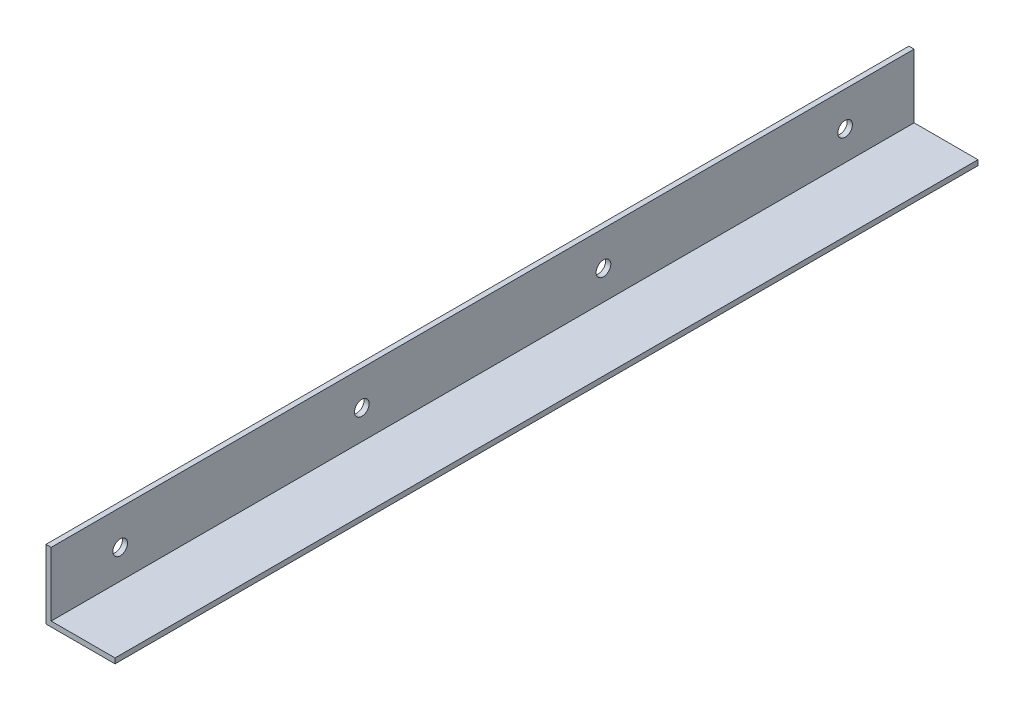
ISO-10303-21;
HEADER;
FILE_DESCRIPTION(('STEP AP214'),'2;1');
FILE_NAME('part.step','',(''),(''),'','','');
FILE_SCHEMA(('AUTOMOTIVE_DESIGN { 1 0 10303 214 1 1 1 1 }'));
ENDSEC;
DATA;
#1=APPLICATION_CONTEXT('core data for automotive mechanical design processes');
#2=APPLICATION_PROTOCOL_DEFINITION('international standard','automotive_design',2000,#1);
#3=PRODUCT_CONTEXT('',#1,'mechanical');
#4=PRODUCT('Part','Part','',(#3));
#5=PRODUCT_RELATED_PRODUCT_CATEGORY('part','',(#4));
#6=PRODUCT_DEFINITION_FORMATION('','',#4);
#7=PRODUCT_DEFINITION_CONTEXT('part definition',#1,'design');
#8=PRODUCT_DEFINITION('design','',#6,#7);
#9=PRODUCT_DEFINITION_SHAPE('','',#8);
#10=(LENGTH_UNIT() NAMED_UNIT(*) SI_UNIT(.MILLI.,.METRE.));
#11=(NAMED_UNIT(*) PLANE_ANGLE_UNIT() SI_UNIT($,.RADIAN.));
#12=(NAMED_UNIT(*) SI_UNIT($,.STERADIAN.) SOLID_ANGLE_UNIT());
#13=UNCERTAINTY_MEASURE_WITH_UNIT(LENGTH_MEASURE(1.E-05),#10,'distance_accuracy_value','');
#14=(GEOMETRIC_REPRESENTATION_CONTEXT(3) GLOBAL_UNCERTAINTY_ASSIGNED_CONTEXT((#13)) GLOBAL_UNIT_ASSIGNED_CONTEXT((#10,
#11,#12)) REPRESENTATION_CONTEXT('',''));
#15=CARTESIAN_POINT('',(0.,0.,0.));
#16=DIRECTION('',(0.,0.,1.));
#17=DIRECTION('',(1.,0.,0.));
#18=AXIS2_PLACEMENT_3D('',#15,#16,#17);
#19=CARTESIAN_POINT('',(0.,0.,500.));
#20=DIRECTION('',(0.,1.,0.));
#21=DIRECTION('',(0.,0.,1.));
#22=AXIS2_PLACEMENT_3D('',#19,#20,#21);
#23=PLANE('',#22);
#24=DIRECTION('',(1.,0.,0.));
#25=VECTOR('',#24,1.);
#26=CARTESIAN_POINT('',(0.,0.,0.));
#27=LINE('',#26,#25);
#28=CARTESIAN_POINT('',(0.,0.,0.));
#29=VERTEX_POINT('',#28);
#30=CARTESIAN_POINT('',(40.,0.,0.));
#31=VERTEX_POINT('',#30);
#32=EDGE_CURVE('E118',#29,#31,#27,.T.);
#33=ORIENTED_EDGE('',*,*,#32,.T.);
#34=DIRECTION('',(0.,0.,-1.));
#35=VECTOR('',#34,1.);
#36=CARTESIAN_POINT('',(40.,0.,500.));
#37=LINE('',#36,#35);
#38=CARTESIAN_POINT('',(40.,0.,500.));
#39=VERTEX_POINT('',#38);
#40=EDGE_CURVE('E11',#39,#31,#37,.T.);
#41=ORIENTED_EDGE('',*,*,#40,.F.);
#42=DIRECTION('',(1.,0.,0.));
#43=VECTOR('',#42,1.);
#44=CARTESIAN_POINT('',(0.,0.,500.));
#45=LINE('',#44,#43);
#46=CARTESIAN_POINT('',(0.,0.,500.));
#47=VERTEX_POINT('',#46);
#48=EDGE_CURVE('E129',#47,#39,#45,.T.);
#49=ORIENTED_EDGE('',*,*,#48,.F.);
#50=DIRECTION('',(0.,0.,-1.));
#51=VECTOR('',#50,1.);
#52=CARTESIAN_POINT('',(0.,0.,500.));
#53=LINE('',#52,#51);
#54=EDGE_CURVE('E114',#47,#29,#53,.T.);
#55=ORIENTED_EDGE('',*,*,#54,.T.);
#56=EDGE_LOOP('',(#33,#41,#49,#55));
#57=FACE_BOUND('',#56,.T.);
#58=ADVANCED_FACE('F34',(#57),#23,.F.);
#59=CARTESIAN_POINT('',(40.,3.,500.));
#60=DIRECTION('',(-1.,0.,0.));
#61=DIRECTION('',(0.,0.,1.));
#62=AXIS2_PLACEMENT_3D('',#59,#60,#61);
#63=PLANE('',#62);
#64=DIRECTION('',(0.,1.,0.));
#65=VECTOR('',#64,1.);
#66=CARTESIAN_POINT('',(40.,3.,0.));
#67=LINE('',#66,#65);
#68=CARTESIAN_POINT('',(40.,3.,0.));
#69=VERTEX_POINT('',#68);
#70=EDGE_CURVE('E121',#31,#69,#67,.T.);
#71=ORIENTED_EDGE('',*,*,#70,.T.);
#72=DIRECTION('',(0.,0.,-1.));
#73=VECTOR('',#72,1.);
#74=CARTESIAN_POINT('',(40.,3.,500.));
#75=LINE('',#74,#73);
#76=CARTESIAN_POINT('',(40.,3.,500.));
#77=VERTEX_POINT('',#76);
#78=EDGE_CURVE('E42',#77,#69,#75,.T.);
#79=ORIENTED_EDGE('',*,*,#78,.F.);
#80=DIRECTION('',(0.,1.,0.));
#81=VECTOR('',#80,1.);
#82=CARTESIAN_POINT('',(40.,3.,500.));
#83=LINE('',#82,#81);
#84=EDGE_CURVE('E87',#39,#77,#83,.T.);
#85=ORIENTED_EDGE('',*,*,#84,.F.);
#86=ORIENTED_EDGE('',*,*,#40,.T.);
#87=EDGE_LOOP('',(#71,#79,#85,#86));
#88=FACE_BOUND('',#87,.T.);
#89=ADVANCED_FACE('F156',(#88),#63,.F.);
#90=CARTESIAN_POINT('',(3.,3.,500.));
#91=DIRECTION('',(0.,-1.,0.));
#92=DIRECTION('',(0.,0.,-1.));
#93=AXIS2_PLACEMENT_3D('',#90,#91,#92);
#94=PLANE('',#93);
#95=DIRECTION('',(-1.,0.,0.));
#96=VECTOR('',#95,1.);
#97=CARTESIAN_POINT('',(3.,3.,0.));
#98=LINE('',#97,#96);
#99=CARTESIAN_POINT('',(3.,3.,0.));
#100=VERTEX_POINT('',#99);
#101=EDGE_CURVE('E124',#69,#100,#98,.T.);
#102=ORIENTED_EDGE('',*,*,#101,.T.);
#103=DIRECTION('',(0.,0.,-1.));
#104=VECTOR('',#103,1.);
#105=CARTESIAN_POINT('',(3.,3.,500.));
#106=LINE('',#105,#104);
#107=CARTESIAN_POINT('',(3.,3.,500.));
#108=VERTEX_POINT('',#107);
#109=EDGE_CURVE('E109',#108,#100,#106,.T.);
#110=ORIENTED_EDGE('',*,*,#109,.F.);
#111=DIRECTION('',(-1.,0.,0.));
#112=VECTOR('',#111,1.);
#113=CARTESIAN_POINT('',(3.,3.,500.));
#114=LINE('',#113,#112);
#115=EDGE_CURVE('E100',#77,#108,#114,.T.);
#116=ORIENTED_EDGE('',*,*,#115,.F.);
#117=ORIENTED_EDGE('',*,*,#78,.T.);
#118=EDGE_LOOP('',(#102,#110,#116,#117));
#119=FACE_BOUND('',#118,.T.);
#120=ADVANCED_FACE('F135',(#119),#94,.F.);
#121=CARTESIAN_POINT('',(3.,3.,500.));
#122=DIRECTION('',(-1.,0.,0.));
#123=DIRECTION('',(0.,0.,1.));
#124=AXIS2_PLACEMENT_3D('',#121,#122,#123);
#125=PLANE('',#124);
#126=CARTESIAN_POINT('',(3.,20.,40.));
#127=DIRECTION('',(-1.,0.,0.));
#128=DIRECTION('',(0.,0.,1.));
#129=AXIS2_PLACEMENT_3D('',#126,#127,#128);
#130=CIRCLE('',#129,4.25);
#131=CARTESIAN_POINT('',(3.,20.,44.25));
#132=VERTEX_POINT('',#131);
#133=EDGE_CURVE('E122',#132,#132,#130,.T.);
#134=ORIENTED_EDGE('',*,*,#133,.T.);
#135=EDGE_LOOP('',(#134));
#136=FACE_BOUND('',#135,.T.);
#137=CARTESIAN_POINT('',(3.,20.,180.));
#138=DIRECTION('',(-1.,0.,0.));
#139=DIRECTION('',(0.,0.,1.));
#140=AXIS2_PLACEMENT_3D('',#137,#138,#139);
#141=CIRCLE('',#140,4.25);
#142=CARTESIAN_POINT('',(3.,20.,184.25));
#143=VERTEX_POINT('',#142);
#144=EDGE_CURVE('E175',#143,#143,#141,.T.);
#145=ORIENTED_EDGE('',*,*,#144,.T.);
#146=EDGE_LOOP('',(#145));
#147=FACE_BOUND('',#146,.T.);
#148=CARTESIAN_POINT('',(3.,20.,320.));
#149=DIRECTION('',(-1.,0.,0.));
#150=DIRECTION('',(0.,0.,1.));
#151=AXIS2_PLACEMENT_3D('',#148,#149,#150);
#152=CIRCLE('',#151,4.24999999999995);
#153=CARTESIAN_POINT('',(3.,20.,324.25));
#154=VERTEX_POINT('',#153);
#155=EDGE_CURVE('E179',#154,#154,#152,.T.);
#156=ORIENTED_EDGE('',*,*,#155,.T.);
#157=EDGE_LOOP('',(#156));
#158=FACE_BOUND('',#157,.T.);
#159=CARTESIAN_POINT('',(3.,20.,460.));
#160=DIRECTION('',(-1.,0.,0.));
#161=DIRECTION('',(0.,0.,1.));
#162=AXIS2_PLACEMENT_3D('',#159,#160,#161);
#163=CIRCLE('',#162,4.24999999999995);
#164=CARTESIAN_POINT('',(3.,20.,464.25));
#165=VERTEX_POINT('',#164);
#166=EDGE_CURVE('E182',#165,#165,#163,.T.);
#167=ORIENTED_EDGE('',*,*,#166,.T.);
#168=EDGE_LOOP('',(#167));
#169=FACE_BOUND('',#168,.T.);
#170=DIRECTION('',(0.,1.,0.));
#171=VECTOR('',#170,1.);
#172=CARTESIAN_POINT('',(3.,3.,0.));
#173=LINE('',#172,#171);
#174=CARTESIAN_POINT('',(3.,40.,0.));
#175=VERTEX_POINT('',#174);
#176=EDGE_CURVE('E108',#100,#175,#173,.T.);
#177=ORIENTED_EDGE('',*,*,#176,.T.);
#178=DIRECTION('',(0.,0.,-1.));
#179=VECTOR('',#178,1.);
#180=CARTESIAN_POINT('',(3.,40.,500.));
#181=LINE('',#180,#179);
#182=CARTESIAN_POINT('',(3.,40.,500.));
#183=VERTEX_POINT('',#182);
#184=EDGE_CURVE('E105',#183,#175,#181,.T.);
#185=ORIENTED_EDGE('',*,*,#184,.F.);
#186=DIRECTION('',(0.,1.,0.));
#187=VECTOR('',#186,1.);
#188=CARTESIAN_POINT('',(3.,3.,500.));
#189=LINE('',#188,#187);
#190=EDGE_CURVE('E94',#108,#183,#189,.T.);
#191=ORIENTED_EDGE('',*,*,#190,.F.);
#192=ORIENTED_EDGE('',*,*,#109,.T.);
#193=EDGE_LOOP('',(#177,#185,#191,#192));
#194=FACE_BOUND('',#193,.T.);
#195=ADVANCED_FACE('F106',(#136,#147,#158,#169,#194),#125,.F.);
#196=CARTESIAN_POINT('',(0.,40.,500.));
#197=DIRECTION('',(0.,-1.,0.));
#198=DIRECTION('',(0.,0.,-1.));
#199=AXIS2_PLACEMENT_3D('',#196,#197,#198);
#200=PLANE('',#199);
#201=DIRECTION('',(-1.,0.,0.));
#202=VECTOR('',#201,1.);
#203=CARTESIAN_POINT('',(0.,40.,0.));
#204=LINE('',#203,#202);
#205=CARTESIAN_POINT('',(0.,40.,0.));
#206=VERTEX_POINT('',#205);
#207=EDGE_CURVE('E73',#175,#206,#204,.T.);
#208=ORIENTED_EDGE('',*,*,#207,.T.);
#209=DIRECTION('',(0.,0.,-1.));
#210=VECTOR('',#209,1.);
#211=CARTESIAN_POINT('',(0.,40.,500.));
#212=LINE('',#211,#210);
#213=CARTESIAN_POINT('',(0.,40.,500.));
#214=VERTEX_POINT('',#213);
#215=EDGE_CURVE('E110',#214,#206,#212,.T.);
#216=ORIENTED_EDGE('',*,*,#215,.F.);
#217=DIRECTION('',(-1.,0.,0.));
#218=VECTOR('',#217,1.);
#219=CARTESIAN_POINT('',(0.,40.,500.));
#220=LINE('',#219,#218);
#221=EDGE_CURVE('E98',#183,#214,#220,.T.);
#222=ORIENTED_EDGE('',*,*,#221,.F.);
#223=ORIENTED_EDGE('',*,*,#184,.T.);
#224=EDGE_LOOP('',(#208,#216,#222,#223));
#225=FACE_BOUND('',#224,.T.);
#226=ADVANCED_FACE('F112',(#225),#200,.F.);
#227=CARTESIAN_POINT('',(0.,0.,500.));
#228=DIRECTION('',(1.,0.,0.));
#229=DIRECTION('',(0.,0.,-1.));
#230=AXIS2_PLACEMENT_3D('',#227,#228,#229);
#231=PLANE('',#230);
#232=CARTESIAN_POINT('',(0.,20.,40.));
#233=DIRECTION('',(-1.,0.,0.));
#234=DIRECTION('',(0.,0.,1.));
#235=AXIS2_PLACEMENT_3D('',#232,#233,#234);
#236=CIRCLE('',#235,4.25);
#237=CARTESIAN_POINT('',(0.,20.,44.25));
#238=VERTEX_POINT('',#237);
#239=EDGE_CURVE('E184',#238,#238,#236,.T.);
#240=ORIENTED_EDGE('',*,*,#239,.F.);
#241=EDGE_LOOP('',(#240));
#242=FACE_BOUND('',#241,.T.);
#243=CARTESIAN_POINT('',(0.,20.,180.));
#244=DIRECTION('',(-1.,0.,0.));
#245=DIRECTION('',(0.,0.,1.));
#246=AXIS2_PLACEMENT_3D('',#243,#244,#245);
#247=CIRCLE('',#246,4.25);
#248=CARTESIAN_POINT('',(0.,20.,184.25));
#249=VERTEX_POINT('',#248);
#250=EDGE_CURVE('E188',#249,#249,#247,.T.);
#251=ORIENTED_EDGE('',*,*,#250,.F.);
#252=EDGE_LOOP('',(#251));
#253=FACE_BOUND('',#252,.T.);
#254=CARTESIAN_POINT('',(0.,20.,320.));
#255=DIRECTION('',(-1.,0.,0.));
#256=DIRECTION('',(0.,0.,1.));
#257=AXIS2_PLACEMENT_3D('',#254,#255,#256);
#258=CIRCLE('',#257,4.24999999999995);
#259=CARTESIAN_POINT('',(0.,20.,324.25));
#260=VERTEX_POINT('',#259);
#261=EDGE_CURVE('E198',#260,#260,#258,.T.);
#262=ORIENTED_EDGE('',*,*,#261,.F.);
#263=EDGE_LOOP('',(#262));
#264=FACE_BOUND('',#263,.T.);
#265=CARTESIAN_POINT('',(0.,20.,460.));
#266=DIRECTION('',(-1.,0.,0.));
#267=DIRECTION('',(0.,0.,1.));
#268=AXIS2_PLACEMENT_3D('',#265,#266,#267);
#269=CIRCLE('',#268,4.24999999999995);
#270=CARTESIAN_POINT('',(0.,20.,464.25));
#271=VERTEX_POINT('',#270);
#272=EDGE_CURVE('E191',#271,#271,#269,.T.);
#273=ORIENTED_EDGE('',*,*,#272,.F.);
#274=EDGE_LOOP('',(#273));
#275=FACE_BOUND('',#274,.T.);
#276=DIRECTION('',(0.,-1.,0.));
#277=VECTOR('',#276,1.);
#278=CARTESIAN_POINT('',(0.,0.,0.));
#279=LINE('',#278,#277);
#280=EDGE_CURVE('E79',#206,#29,#279,.T.);
#281=ORIENTED_EDGE('',*,*,#280,.T.);
#282=ORIENTED_EDGE('',*,*,#54,.F.);
#283=DIRECTION('',(0.,-1.,0.));
#284=VECTOR('',#283,1.);
#285=CARTESIAN_POINT('',(0.,0.,500.));
#286=LINE('',#285,#284);
#287=EDGE_CURVE('E50',#214,#47,#286,.T.);
#288=ORIENTED_EDGE('',*,*,#287,.F.);
#289=ORIENTED_EDGE('',*,*,#215,.T.);
#290=EDGE_LOOP('',(#281,#282,#288,#289));
#291=FACE_BOUND('',#290,.T.);
#292=ADVANCED_FACE('F142',(#242,#253,#264,#275,#291),#231,.F.);
#293=CARTESIAN_POINT('',(0.,0.,500.));
#294=DIRECTION('',(0.,0.,-1.));
#295=DIRECTION('',(-1.,0.,0.));
#296=AXIS2_PLACEMENT_3D('',#293,#294,#295);
#297=PLANE('',#296);
#298=ORIENTED_EDGE('',*,*,#48,.T.);
#299=ORIENTED_EDGE('',*,*,#84,.T.);
#300=ORIENTED_EDGE('',*,*,#115,.T.);
#301=ORIENTED_EDGE('',*,*,#190,.T.);
#302=ORIENTED_EDGE('',*,*,#221,.T.);
#303=ORIENTED_EDGE('',*,*,#287,.T.);
#304=EDGE_LOOP('',(#298,#299,#300,#301,#302,#303));
#305=FACE_BOUND('',#304,.T.);
#306=ADVANCED_FACE('F96',(#305),#297,.F.);
#307=CARTESIAN_POINT('',(0.,0.,0.));
#308=DIRECTION('',(0.,0.,-1.));
#309=DIRECTION('',(-1.,0.,0.));
#310=AXIS2_PLACEMENT_3D('',#307,#308,#309);
#311=PLANE('',#310);
#312=ORIENTED_EDGE('',*,*,#32,.F.);
#313=ORIENTED_EDGE('',*,*,#280,.F.);
#314=ORIENTED_EDGE('',*,*,#207,.F.);
#315=ORIENTED_EDGE('',*,*,#176,.F.);
#316=ORIENTED_EDGE('',*,*,#101,.F.);
#317=ORIENTED_EDGE('',*,*,#70,.F.);
#318=EDGE_LOOP('',(#312,#313,#314,#315,#316,#317));
#319=FACE_BOUND('',#318,.T.);
#320=ADVANCED_FACE('F138',(#319),#311,.T.);
#321=CARTESIAN_POINT('',(10.,20.,460.));
#322=DIRECTION('',(-1.,0.,0.));
#323=DIRECTION('',(0.,0.,1.));
#324=AXIS2_PLACEMENT_3D('',#321,#322,#323);
#325=CYLINDRICAL_SURFACE('',#324,4.24999999999995);
#326=ORIENTED_EDGE('',*,*,#272,.T.);
#327=EDGE_LOOP('',(#326));
#328=FACE_BOUND('',#327,.T.);
#329=ORIENTED_EDGE('',*,*,#166,.F.);
#330=EDGE_LOOP('',(#329));
#331=FACE_BOUND('',#330,.T.);
#332=ADVANCED_FACE('F211',(#328,#331),#325,.F.);
#333=CARTESIAN_POINT('',(10.,20.,320.));
#334=DIRECTION('',(-1.,0.,0.));
#335=DIRECTION('',(0.,0.,1.));
#336=AXIS2_PLACEMENT_3D('',#333,#334,#335);
#337=CYLINDRICAL_SURFACE('',#336,4.24999999999995);
#338=ORIENTED_EDGE('',*,*,#261,.T.);
#339=EDGE_LOOP('',(#338));
#340=FACE_BOUND('',#339,.T.);
#341=ORIENTED_EDGE('',*,*,#155,.F.);
#342=EDGE_LOOP('',(#341));
#343=FACE_BOUND('',#342,.T.);
#344=ADVANCED_FACE('F213',(#340,#343),#337,.F.);
#345=CARTESIAN_POINT('',(10.,20.,180.));
#346=DIRECTION('',(-1.,0.,0.));
#347=DIRECTION('',(0.,0.,1.));
#348=AXIS2_PLACEMENT_3D('',#345,#346,#347);
#349=CYLINDRICAL_SURFACE('',#348,4.25);
#350=ORIENTED_EDGE('',*,*,#250,.T.);
#351=EDGE_LOOP('',(#350));
#352=FACE_BOUND('',#351,.T.);
#353=ORIENTED_EDGE('',*,*,#144,.F.);
#354=EDGE_LOOP('',(#353));
#355=FACE_BOUND('',#354,.T.);
#356=ADVANCED_FACE('F204',(#352,#355),#349,.F.);
#357=CARTESIAN_POINT('',(10.,20.,40.));
#358=DIRECTION('',(-1.,0.,0.));
#359=DIRECTION('',(0.,0.,1.));
#360=AXIS2_PLACEMENT_3D('',#357,#358,#359);
#361=CYLINDRICAL_SURFACE('',#360,4.25);
#362=ORIENTED_EDGE('',*,*,#239,.T.);
#363=EDGE_LOOP('',(#362));
#364=FACE_BOUND('',#363,.T.);
#365=ORIENTED_EDGE('',*,*,#133,.F.);
#366=EDGE_LOOP('',(#365));
#367=FACE_BOUND('',#366,.T.);
#368=ADVANCED_FACE('F224',(#364,#367),#361,.F.);
#369=CLOSED_SHELL('',(#58,#89,#120,#195,#226,#292,#306,#320,#332,#344,#356,#368));
#370=MANIFOLD_SOLID_BREP('B2',#369);
#371=ADVANCED_BREP_SHAPE_REPRESENTATION('',(#18,#370),#14);
#372=SHAPE_DEFINITION_REPRESENTATION(#9,#371);
ENDSEC;
END-ISO-10303-21;
